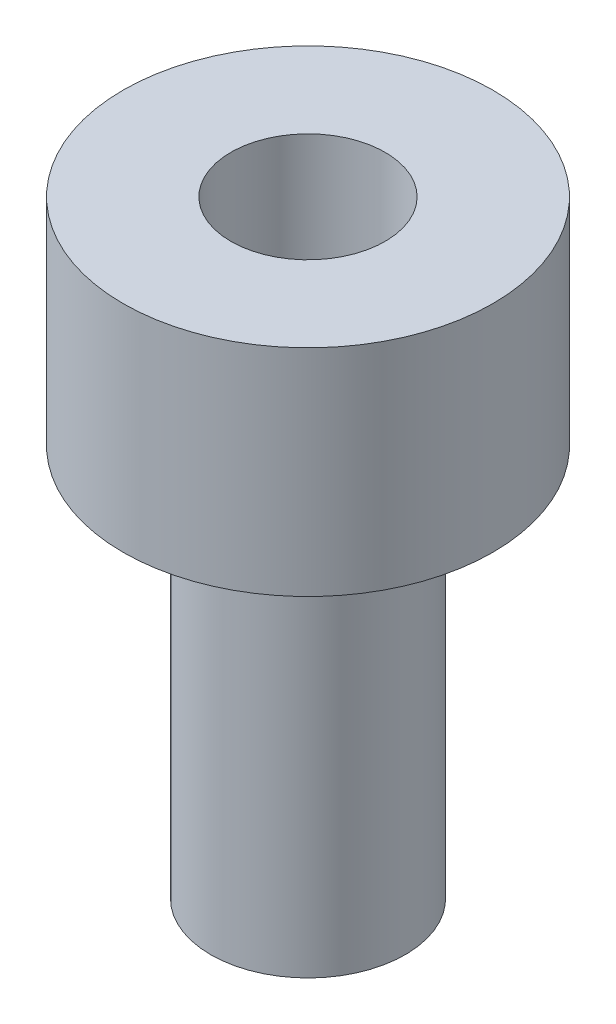
ISO-10303-21;
HEADER;
FILE_DESCRIPTION(('STEP AP214'),'2;1');
FILE_NAME('part.step','',(''),(''),'','','');
FILE_SCHEMA(('AUTOMOTIVE_DESIGN { 1 0 10303 214 1 1 1 1 }'));
ENDSEC;
DATA;
#1=APPLICATION_CONTEXT('core data for automotive mechanical design processes');
#2=APPLICATION_PROTOCOL_DEFINITION('international standard','automotive_design',2000,#1);
#3=PRODUCT_CONTEXT('',#1,'mechanical');
#4=PRODUCT('Part','Part','',(#3));
#5=PRODUCT_RELATED_PRODUCT_CATEGORY('part','',(#4));
#6=PRODUCT_DEFINITION_FORMATION('','',#4);
#7=PRODUCT_DEFINITION_CONTEXT('part definition',#1,'design');
#8=PRODUCT_DEFINITION('design','',#6,#7);
#9=PRODUCT_DEFINITION_SHAPE('','',#8);
#10=(LENGTH_UNIT() NAMED_UNIT(*) SI_UNIT(.MILLI.,.METRE.));
#11=(NAMED_UNIT(*) PLANE_ANGLE_UNIT() SI_UNIT($,.RADIAN.));
#12=(NAMED_UNIT(*) SI_UNIT($,.STERADIAN.) SOLID_ANGLE_UNIT());
#13=UNCERTAINTY_MEASURE_WITH_UNIT(LENGTH_MEASURE(1.E-05),#10,'distance_accuracy_value','');
#14=(GEOMETRIC_REPRESENTATION_CONTEXT(3) GLOBAL_UNCERTAINTY_ASSIGNED_CONTEXT((#13)) GLOBAL_UNIT_ASSIGNED_CONTEXT((#10,
#11,#12)) REPRESENTATION_CONTEXT('',''));
#15=CARTESIAN_POINT('',(0.,0.,0.));
#16=DIRECTION('',(0.,0.,1.));
#17=DIRECTION('',(1.,0.,0.));
#18=AXIS2_PLACEMENT_3D('',#15,#16,#17);
#19=CARTESIAN_POINT('',(0.,12.2,0.));
#20=DIRECTION('',(0.,-1.,0.));
#21=DIRECTION('',(0.,0.,-1.));
#22=AXIS2_PLACEMENT_3D('',#19,#20,#21);
#23=CYLINDRICAL_SURFACE('',#22,3.025);
#24=CARTESIAN_POINT('',(0.,12.2,0.));
#25=DIRECTION('',(0.,1.,0.));
#26=DIRECTION('',(0.,0.,1.));
#27=AXIS2_PLACEMENT_3D('',#24,#25,#26);
#28=CIRCLE('',#27,3.025);
#29=CARTESIAN_POINT('',(0.,12.2,3.025));
#30=VERTEX_POINT('',#29);
#31=EDGE_CURVE('E49',#30,#30,#28,.T.);
#32=ORIENTED_EDGE('',*,*,#31,.F.);
#33=EDGE_LOOP('',(#32));
#34=FACE_BOUND('',#33,.T.);
#35=CARTESIAN_POINT('',(0.,0.,0.));
#36=DIRECTION('',(0.,1.,0.));
#37=DIRECTION('',(0.,0.,1.));
#38=AXIS2_PLACEMENT_3D('',#35,#36,#37);
#39=CIRCLE('',#38,3.025);
#40=CARTESIAN_POINT('',(0.,0.,3.025));
#41=VERTEX_POINT('',#40);
#42=EDGE_CURVE('E53',#41,#41,#39,.T.);
#43=ORIENTED_EDGE('',*,*,#42,.T.);
#44=EDGE_LOOP('',(#43));
#45=FACE_BOUND('',#44,.T.);
#46=ADVANCED_FACE('F43',(#34,#45),#23,.T.);
#47=CARTESIAN_POINT('',(0.,0.,0.));
#48=DIRECTION('',(0.,1.,0.));
#49=DIRECTION('',(0.,0.,1.));
#50=AXIS2_PLACEMENT_3D('',#47,#48,#49);
#51=PLANE('',#50);
#52=ORIENTED_EDGE('',*,*,#42,.F.);
#53=EDGE_LOOP('',(#52));
#54=FACE_BOUND('',#53,.T.);
#55=ADVANCED_FACE('F74',(#54),#51,.F.);
#56=CARTESIAN_POINT('',(0.,18.9,0.));
#57=DIRECTION('',(0.,1.,0.));
#58=DIRECTION('',(0.,0.,1.));
#59=AXIS2_PLACEMENT_3D('',#56,#57,#58);
#60=PLANE('',#59);
#61=CARTESIAN_POINT('',(0.,18.9,0.));
#62=DIRECTION('',(0.,1.,0.));
#63=DIRECTION('',(0.,0.,1.));
#64=AXIS2_PLACEMENT_3D('',#61,#62,#63);
#65=CIRCLE('',#64,5.75);
#66=CARTESIAN_POINT('',(0.,18.9,5.75));
#67=VERTEX_POINT('',#66);
#68=EDGE_CURVE('E58',#67,#67,#65,.T.);
#69=ORIENTED_EDGE('',*,*,#68,.T.);
#70=EDGE_LOOP('',(#69));
#71=FACE_BOUND('',#70,.T.);
#72=CARTESIAN_POINT('',(0.,18.9,0.));
#73=DIRECTION('',(0.,1.,0.));
#74=DIRECTION('',(0.,0.,1.));
#75=AXIS2_PLACEMENT_3D('',#72,#73,#74);
#76=CIRCLE('',#75,2.4);
#77=CARTESIAN_POINT('',(0.,18.9,2.4));
#78=VERTEX_POINT('',#77);
#79=EDGE_CURVE('E63',#78,#78,#76,.T.);
#80=ORIENTED_EDGE('',*,*,#79,.F.);
#81=EDGE_LOOP('',(#80));
#82=FACE_BOUND('',#81,.T.);
#83=ADVANCED_FACE('F71',(#71,#82),#60,.T.);
#84=CARTESIAN_POINT('',(0.,12.2,0.));
#85=DIRECTION('',(0.,1.,0.));
#86=DIRECTION('',(0.,0.,1.));
#87=AXIS2_PLACEMENT_3D('',#84,#85,#86);
#88=PLANE('',#87);
#89=ORIENTED_EDGE('',*,*,#31,.T.);
#90=EDGE_LOOP('',(#89));
#91=FACE_BOUND('',#90,.T.);
#92=CARTESIAN_POINT('',(0.,12.2,0.));
#93=DIRECTION('',(0.,1.,0.));
#94=DIRECTION('',(0.,0.,1.));
#95=AXIS2_PLACEMENT_3D('',#92,#93,#94);
#96=CIRCLE('',#95,5.75);
#97=CARTESIAN_POINT('',(0.,12.2,5.75));
#98=VERTEX_POINT('',#97);
#99=EDGE_CURVE('E60',#98,#98,#96,.T.);
#100=ORIENTED_EDGE('',*,*,#99,.F.);
#101=EDGE_LOOP('',(#100));
#102=FACE_BOUND('',#101,.T.);
#103=ADVANCED_FACE('F73',(#91,#102),#88,.F.);
#104=CARTESIAN_POINT('',(0.,18.9,0.));
#105=DIRECTION('',(0.,-1.,0.));
#106=DIRECTION('',(0.,0.,-1.));
#107=AXIS2_PLACEMENT_3D('',#104,#105,#106);
#108=CYLINDRICAL_SURFACE('',#107,5.75);
#109=ORIENTED_EDGE('',*,*,#68,.F.);
#110=EDGE_LOOP('',(#109));
#111=FACE_BOUND('',#110,.T.);
#112=ORIENTED_EDGE('',*,*,#99,.T.);
#113=EDGE_LOOP('',(#112));
#114=FACE_BOUND('',#113,.T.);
#115=ADVANCED_FACE('F81',(#111,#114),#108,.T.);
#116=CARTESIAN_POINT('',(0.,18.9,0.));
#117=DIRECTION('',(0.,-1.,0.));
#118=DIRECTION('',(0.,0.,-1.));
#119=AXIS2_PLACEMENT_3D('',#116,#117,#118);
#120=CYLINDRICAL_SURFACE('',#119,2.4);
#121=CARTESIAN_POINT('',(0.,13.6,0.));
#122=DIRECTION('',(0.,1.,0.));
#123=DIRECTION('',(0.,0.,1.));
#124=AXIS2_PLACEMENT_3D('',#121,#122,#123);
#125=CIRCLE('',#124,2.4);
#126=CARTESIAN_POINT('',(0.,13.6,2.4));
#127=VERTEX_POINT('',#126);
#128=EDGE_CURVE('E11',#127,#127,#125,.T.);
#129=ORIENTED_EDGE('',*,*,#128,.F.);
#130=EDGE_LOOP('',(#129));
#131=FACE_BOUND('',#130,.T.);
#132=ORIENTED_EDGE('',*,*,#79,.T.);
#133=EDGE_LOOP('',(#132));
#134=FACE_BOUND('',#133,.T.);
#135=ADVANCED_FACE('F69',(#131,#134),#120,.F.);
#136=CARTESIAN_POINT('',(0.,13.6,0.));
#137=DIRECTION('',(0.,1.,0.));
#138=DIRECTION('',(0.,0.,1.));
#139=AXIS2_PLACEMENT_3D('',#136,#137,#138);
#140=PLANE('',#139);
#141=ORIENTED_EDGE('',*,*,#128,.T.);
#142=EDGE_LOOP('',(#141));
#143=FACE_BOUND('',#142,.T.);
#144=ADVANCED_FACE('F125',(#143),#140,.T.);
#145=CLOSED_SHELL('',(#46,#55,#83,#103,#115,#135,#144));
#146=MANIFOLD_SOLID_BREP('B2',#145);
#147=ADVANCED_BREP_SHAPE_REPRESENTATION('',(#18,#146),#14);
#148=SHAPE_DEFINITION_REPRESENTATION(#9,#147);
ENDSEC;
END-ISO-10303-21;
